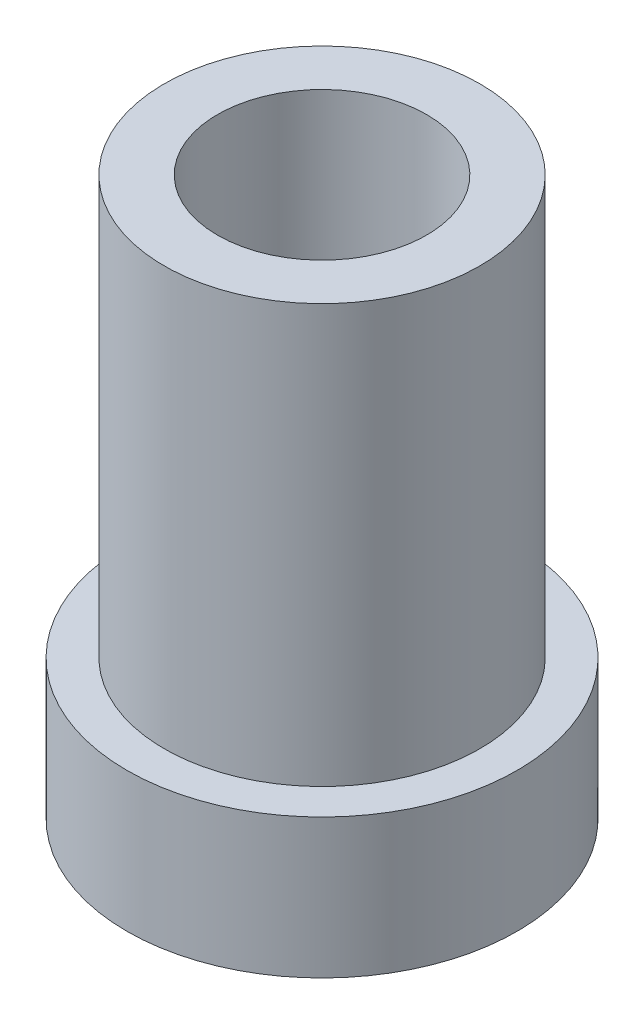
ISO-10303-21;
HEADER;
FILE_DESCRIPTION(('STEP AP214'),'2;1');
FILE_NAME('part.step','',(''),(''),'','','');
FILE_SCHEMA(('AUTOMOTIVE_DESIGN { 1 0 10303 214 1 1 1 1 }'));
ENDSEC;
DATA;
#1=APPLICATION_CONTEXT('core data for automotive mechanical design processes');
#2=APPLICATION_PROTOCOL_DEFINITION('international standard','automotive_design',2000,#1);
#3=PRODUCT_CONTEXT('',#1,'mechanical');
#4=PRODUCT('Part','Part','',(#3));
#5=PRODUCT_RELATED_PRODUCT_CATEGORY('part','',(#4));
#6=PRODUCT_DEFINITION_FORMATION('','',#4);
#7=PRODUCT_DEFINITION_CONTEXT('part definition',#1,'design');
#8=PRODUCT_DEFINITION('design','',#6,#7);
#9=PRODUCT_DEFINITION_SHAPE('','',#8);
#10=(LENGTH_UNIT() NAMED_UNIT(*) SI_UNIT(.MILLI.,.METRE.));
#11=(NAMED_UNIT(*) PLANE_ANGLE_UNIT() SI_UNIT($,.RADIAN.));
#12=(NAMED_UNIT(*) SI_UNIT($,.STERADIAN.) SOLID_ANGLE_UNIT());
#13=UNCERTAINTY_MEASURE_WITH_UNIT(LENGTH_MEASURE(1.E-05),#10,'distance_accuracy_value','');
#14=(GEOMETRIC_REPRESENTATION_CONTEXT(3) GLOBAL_UNCERTAINTY_ASSIGNED_CONTEXT((#13)) GLOBAL_UNIT_ASSIGNED_CONTEXT((#10,
#11,#12)) REPRESENTATION_CONTEXT('',''));
#15=CARTESIAN_POINT('',(0.,0.,0.));
#16=DIRECTION('',(0.,0.,1.));
#17=DIRECTION('',(1.,0.,0.));
#18=AXIS2_PLACEMENT_3D('',#15,#16,#17);
#19=CARTESIAN_POINT('',(0.,3.175,0.));
#20=DIRECTION('',(0.,-1.,0.));
#21=DIRECTION('',(0.,0.,-1.));
#22=AXIS2_PLACEMENT_3D('',#19,#20,#21);
#23=CYLINDRICAL_SURFACE('',#22,4.445);
#24=CARTESIAN_POINT('',(0.,3.175,0.));
#25=DIRECTION('',(0.,1.,0.));
#26=DIRECTION('',(0.,0.,1.));
#27=AXIS2_PLACEMENT_3D('',#24,#25,#26);
#28=CIRCLE('',#27,4.445);
#29=CARTESIAN_POINT('',(0.,3.175,4.445));
#30=VERTEX_POINT('',#29);
#31=EDGE_CURVE('E51',#30,#30,#28,.T.);
#32=ORIENTED_EDGE('',*,*,#31,.F.);
#33=EDGE_LOOP('',(#32));
#34=FACE_BOUND('',#33,.T.);
#35=CARTESIAN_POINT('',(0.,0.,0.));
#36=DIRECTION('',(0.,1.,0.));
#37=DIRECTION('',(0.,0.,1.));
#38=AXIS2_PLACEMENT_3D('',#35,#36,#37);
#39=CIRCLE('',#38,4.445);
#40=CARTESIAN_POINT('',(0.,0.,4.445));
#41=VERTEX_POINT('',#40);
#42=EDGE_CURVE('E46',#41,#41,#39,.T.);
#43=ORIENTED_EDGE('',*,*,#42,.T.);
#44=EDGE_LOOP('',(#43));
#45=FACE_BOUND('',#44,.T.);
#46=ADVANCED_FACE('F43',(#34,#45),#23,.T.);
#47=CARTESIAN_POINT('',(0.,3.175,0.));
#48=DIRECTION('',(0.,1.,0.));
#49=DIRECTION('',(0.,0.,1.));
#50=AXIS2_PLACEMENT_3D('',#47,#48,#49);
#51=PLANE('',#50);
#52=CARTESIAN_POINT('',(0.,3.175,0.));
#53=DIRECTION('',(0.,1.,0.));
#54=DIRECTION('',(0.,0.,1.));
#55=AXIS2_PLACEMENT_3D('',#52,#53,#54);
#56=CIRCLE('',#55,3.5941);
#57=CARTESIAN_POINT('',(0.,3.175,-3.5941));
#58=VERTEX_POINT('',#57);
#59=EDGE_CURVE('E10',#58,#58,#56,.T.);
#60=ORIENTED_EDGE('',*,*,#59,.F.);
#61=EDGE_LOOP('',(#60));
#62=FACE_BOUND('',#61,.T.);
#63=ORIENTED_EDGE('',*,*,#31,.T.);
#64=EDGE_LOOP('',(#63));
#65=FACE_BOUND('',#64,.T.);
#66=ADVANCED_FACE('F86',(#62,#65),#51,.T.);
#67=CARTESIAN_POINT('',(0.,0.,0.));
#68=DIRECTION('',(0.,1.,0.));
#69=DIRECTION('',(0.,0.,1.));
#70=AXIS2_PLACEMENT_3D('',#67,#68,#69);
#71=PLANE('',#70);
#72=CARTESIAN_POINT('',(0.,0.,0.));
#73=DIRECTION('',(0.,1.,0.));
#74=DIRECTION('',(0.,0.,1.));
#75=AXIS2_PLACEMENT_3D('',#72,#73,#74);
#76=CIRCLE('',#75,2.38125);
#77=CARTESIAN_POINT('',(0.,0.,2.38125));
#78=VERTEX_POINT('',#77);
#79=EDGE_CURVE('E62',#78,#78,#76,.F.);
#80=ORIENTED_EDGE('',*,*,#79,.F.);
#81=EDGE_LOOP('',(#80));
#82=FACE_BOUND('',#81,.T.);
#83=ORIENTED_EDGE('',*,*,#42,.F.);
#84=EDGE_LOOP('',(#83));
#85=FACE_BOUND('',#84,.T.);
#86=ADVANCED_FACE('F81',(#82,#85),#71,.F.);
#87=CARTESIAN_POINT('',(0.,12.7,0.));
#88=DIRECTION('',(0.,-1.,0.));
#89=DIRECTION('',(0.,0.,-1.));
#90=AXIS2_PLACEMENT_3D('',#87,#88,#89);
#91=CYLINDRICAL_SURFACE('',#90,3.5941);
#92=CARTESIAN_POINT('',(0.,12.7,0.));
#93=DIRECTION('',(0.,1.,0.));
#94=DIRECTION('',(0.,0.,1.));
#95=AXIS2_PLACEMENT_3D('',#92,#93,#94);
#96=CIRCLE('',#95,3.5941);
#97=CARTESIAN_POINT('',(0.,12.7,-3.5941));
#98=VERTEX_POINT('',#97);
#99=EDGE_CURVE('E58',#98,#98,#96,.T.);
#100=CARTESIAN_POINT('',(0.,12.7,-3.5941));
#101=CARTESIAN_POINT('',(0.,12.60078125,-3.5941));
#102=CARTESIAN_POINT('',(0.,12.5015625,-3.5941));
#103=CARTESIAN_POINT('',(0.,12.303125,-3.5941));
#104=CARTESIAN_POINT('',(0.,12.20390625,-3.5941));
#105=CARTESIAN_POINT('',(0.,12.00546875,-3.5941));
#106=CARTESIAN_POINT('',(0.,11.90625,-3.5941));
#107=CARTESIAN_POINT('',(0.,11.7078125,-3.5941));
#108=CARTESIAN_POINT('',(0.,11.60859375,-3.5941));
#109=CARTESIAN_POINT('',(0.,11.41015625,-3.5941));
#110=CARTESIAN_POINT('',(0.,11.3109375,-3.5941));
#111=CARTESIAN_POINT('',(0.,11.1125,-3.5941));
#112=CARTESIAN_POINT('',(0.,11.01328125,-3.5941));
#113=CARTESIAN_POINT('',(0.,10.81484375,-3.5941));
#114=CARTESIAN_POINT('',(0.,10.715625,-3.5941));
#115=CARTESIAN_POINT('',(0.,10.5171875,-3.5941));
#116=CARTESIAN_POINT('',(0.,10.41796875,-3.5941));
#117=CARTESIAN_POINT('',(0.,10.21953125,-3.5941));
#118=CARTESIAN_POINT('',(0.,10.1203125,-3.5941));
#119=CARTESIAN_POINT('',(0.,9.921875,-3.5941));
#120=CARTESIAN_POINT('',(0.,9.82265625,-3.5941));
#121=CARTESIAN_POINT('',(0.,9.62421875,-3.5941));
#122=CARTESIAN_POINT('',(0.,9.525,-3.5941));
#123=CARTESIAN_POINT('',(0.,9.3265625,-3.5941));
#124=CARTESIAN_POINT('',(0.,9.22734375,-3.5941));
#125=CARTESIAN_POINT('',(0.,9.02890625,-3.5941));
#126=CARTESIAN_POINT('',(0.,8.9296875,-3.5941));
#127=CARTESIAN_POINT('',(0.,8.73125,-3.5941));
#128=CARTESIAN_POINT('',(0.,8.63203125,-3.5941));
#129=CARTESIAN_POINT('',(0.,8.43359375,-3.5941));
#130=CARTESIAN_POINT('',(0.,8.334375,-3.5941));
#131=CARTESIAN_POINT('',(0.,8.1359375,-3.5941));
#132=CARTESIAN_POINT('',(0.,8.03671875,-3.5941));
#133=CARTESIAN_POINT('',(0.,7.83828125,-3.5941));
#134=CARTESIAN_POINT('',(0.,7.7390625,-3.5941));
#135=CARTESIAN_POINT('',(0.,7.540625,-3.5941));
#136=CARTESIAN_POINT('',(0.,7.44140625,-3.5941));
#137=CARTESIAN_POINT('',(0.,7.24296875,-3.5941));
#138=CARTESIAN_POINT('',(0.,7.14375,-3.5941));
#139=CARTESIAN_POINT('',(0.,6.9453125,-3.5941));
#140=CARTESIAN_POINT('',(0.,6.84609375,-3.5941));
#141=CARTESIAN_POINT('',(0.,6.64765625,-3.5941));
#142=CARTESIAN_POINT('',(0.,6.5484375,-3.5941));
#143=CARTESIAN_POINT('',(0.,6.35,-3.5941));
#144=CARTESIAN_POINT('',(0.,6.25078125,-3.5941));
#145=CARTESIAN_POINT('',(0.,6.05234375,-3.5941));
#146=CARTESIAN_POINT('',(0.,5.953125,-3.5941));
#147=CARTESIAN_POINT('',(0.,5.7546875,-3.5941));
#148=CARTESIAN_POINT('',(0.,5.65546875,-3.5941));
#149=CARTESIAN_POINT('',(0.,5.45703125,-3.5941));
#150=CARTESIAN_POINT('',(0.,5.3578125,-3.5941));
#151=CARTESIAN_POINT('',(0.,5.159375,-3.5941));
#152=CARTESIAN_POINT('',(0.,5.06015625,-3.5941));
#153=CARTESIAN_POINT('',(0.,4.86171875,-3.5941));
#154=CARTESIAN_POINT('',(0.,4.7625,-3.5941));
#155=CARTESIAN_POINT('',(0.,4.5640625,-3.5941));
#156=CARTESIAN_POINT('',(0.,4.46484375,-3.5941));
#157=CARTESIAN_POINT('',(0.,4.26640625,-3.5941));
#158=CARTESIAN_POINT('',(0.,4.1671875,-3.5941));
#159=CARTESIAN_POINT('',(0.,3.96875,-3.5941));
#160=CARTESIAN_POINT('',(0.,3.86953125,-3.5941));
#161=CARTESIAN_POINT('',(0.,3.67109375,-3.5941));
#162=CARTESIAN_POINT('',(0.,3.571875,-3.5941));
#163=CARTESIAN_POINT('',(0.,3.3734375,-3.5941));
#164=CARTESIAN_POINT('',(0.,3.27421875,-3.5941));
#165=CARTESIAN_POINT('',(0.,3.175,-3.5941));
#166=B_SPLINE_CURVE_WITH_KNOTS('',3,(#100,#101,#102,#103,#104,#105,#106,#107,#108,#109,#110,
#111,#112,#113,#114,#115,#116,#117,#118,#119,#120,#121,#122,#123,#124,#125,#126,#127,#128,#129,
#130,#131,#132,#133,#134,#135,#136,#137,#138,#139,#140,#141,#142,#143,#144,#145,#146,#147,#148,
#149,#150,#151,#152,#153,#154,#155,#156,#157,#158,#159,#160,#161,#162,#163,#164,#165),
.UNSPECIFIED.,.F.,.F.,(4,2,2,2,2,2,2,2,2,2,2,2,2,2,2,2,2,2,2,2,2,2,2,2,2,2,2,2,2,2,2,2,4),(0.,
0.29765625,0.5953125,0.892968750000001,1.190625,1.48828125,1.7859375,2.08359375,2.38125,
2.67890625,2.9765625,3.27421875,3.571875,3.86953125,4.1671875,4.46484375,4.7625,5.06015625,
5.3578125,5.65546875,5.953125,6.25078125,6.5484375,6.84609375,7.14375,7.44140625,7.7390625,
8.03671875,8.334375,8.63203125,8.9296875,9.22734375,9.525),.UNSPECIFIED.);
#167=EDGE_CURVE('BSEAM76',#98,#58,#166,.T.);
#168=ORIENTED_EDGE('',*,*,#99,.F.);
#169=ORIENTED_EDGE('',*,*,#59,.T.);
#170=ORIENTED_EDGE('',*,*,#167,.T.);
#171=ORIENTED_EDGE('',*,*,#167,.F.);
#172=EDGE_LOOP('',(#168,#170,#169,#171));
#173=FACE_BOUND('',#172,.T.);
#174=ADVANCED_FACE('F76',(#173),#91,.T.);
#175=CARTESIAN_POINT('',(0.,12.7,0.));
#176=DIRECTION('',(0.,1.,0.));
#177=DIRECTION('',(0.,0.,1.));
#178=AXIS2_PLACEMENT_3D('',#175,#176,#177);
#179=PLANE('',#178);
#180=CARTESIAN_POINT('',(0.,12.7,0.));
#181=DIRECTION('',(0.,1.,0.));
#182=DIRECTION('',(0.,0.,1.));
#183=AXIS2_PLACEMENT_3D('',#180,#181,#182);
#184=CIRCLE('',#183,2.38125);
#185=CARTESIAN_POINT('',(0.,12.7,2.38125));
#186=VERTEX_POINT('',#185);
#187=EDGE_CURVE('E66',#186,#186,#184,.T.);
#188=ORIENTED_EDGE('',*,*,#187,.F.);
#189=EDGE_LOOP('',(#188));
#190=FACE_BOUND('',#189,.T.);
#191=ORIENTED_EDGE('',*,*,#99,.T.);
#192=EDGE_LOOP('',(#191));
#193=FACE_BOUND('',#192,.T.);
#194=ADVANCED_FACE('F73',(#190,#193),#179,.T.);
#195=CARTESIAN_POINT('',(0.,-6.73519209080187,0.));
#196=DIRECTION('',(0.,1.,0.));
#197=DIRECTION('',(0.,0.,1.));
#198=AXIS2_PLACEMENT_3D('',#195,#196,#197);
#199=CYLINDRICAL_SURFACE('',#198,2.38125);
#200=ORIENTED_EDGE('',*,*,#79,.T.);
#201=EDGE_LOOP('',(#200));
#202=FACE_BOUND('',#201,.T.);
#203=ORIENTED_EDGE('',*,*,#187,.T.);
#204=EDGE_LOOP('',(#203));
#205=FACE_BOUND('',#204,.T.);
#206=ADVANCED_FACE('F71',(#202,#205),#199,.F.);
#207=CLOSED_SHELL('',(#46,#66,#86,#174,#194,#206));
#208=MANIFOLD_SOLID_BREP('B2',#207);
#209=ADVANCED_BREP_SHAPE_REPRESENTATION('',(#18,#208),#14);
#210=SHAPE_DEFINITION_REPRESENTATION(#9,#209);
ENDSEC;
END-ISO-10303-21;
